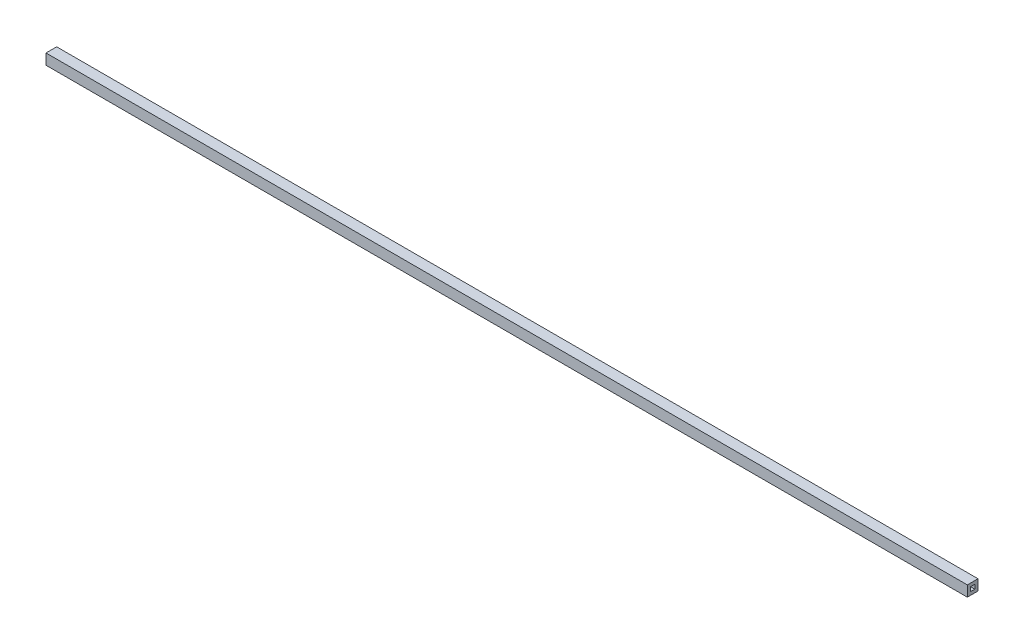
ISO-10303-21;
HEADER;
FILE_DESCRIPTION(('STEP AP214'),'2;1');
FILE_NAME('part.step','',(''),(''),'','','');
FILE_SCHEMA(('AUTOMOTIVE_DESIGN { 1 0 10303 214 1 1 1 1 }'));
ENDSEC;
DATA;
#1=APPLICATION_CONTEXT('core data for automotive mechanical design processes');
#2=APPLICATION_PROTOCOL_DEFINITION('international standard','automotive_design',2000,#1);
#3=PRODUCT_CONTEXT('',#1,'mechanical');
#4=PRODUCT('Part','Part','',(#3));
#5=PRODUCT_RELATED_PRODUCT_CATEGORY('part','',(#4));
#6=PRODUCT_DEFINITION_FORMATION('','',#4);
#7=PRODUCT_DEFINITION_CONTEXT('part definition',#1,'design');
#8=PRODUCT_DEFINITION('design','',#6,#7);
#9=PRODUCT_DEFINITION_SHAPE('','',#8);
#10=(LENGTH_UNIT() NAMED_UNIT(*) SI_UNIT(.MILLI.,.METRE.));
#11=(NAMED_UNIT(*) PLANE_ANGLE_UNIT() SI_UNIT($,.RADIAN.));
#12=(NAMED_UNIT(*) SI_UNIT($,.STERADIAN.) SOLID_ANGLE_UNIT());
#13=UNCERTAINTY_MEASURE_WITH_UNIT(LENGTH_MEASURE(1.E-05),#10,'distance_accuracy_value','');
#14=(GEOMETRIC_REPRESENTATION_CONTEXT(3) GLOBAL_UNCERTAINTY_ASSIGNED_CONTEXT((#13)) GLOBAL_UNIT_ASSIGNED_CONTEXT((#10,
#11,#12)) REPRESENTATION_CONTEXT('',''));
#15=CARTESIAN_POINT('',(0.,0.,0.));
#16=DIRECTION('',(0.,0.,1.));
#17=DIRECTION('',(1.,0.,0.));
#18=AXIS2_PLACEMENT_3D('',#15,#16,#17);
#19=CARTESIAN_POINT('',(432.,0.,0.));
#20=DIRECTION('',(1.,0.,0.));
#21=DIRECTION('',(0.,0.,-1.));
#22=AXIS2_PLACEMENT_3D('',#19,#20,#21);
#23=PLANE('',#22);
#24=DIRECTION('',(0.,1.,0.));
#25=VECTOR('',#24,1.);
#26=CARTESIAN_POINT('',(432.,2.5,-2.5));
#27=LINE('',#26,#25);
#28=CARTESIAN_POINT('',(432.,-2.5,-2.5));
#29=VERTEX_POINT('',#28);
#30=CARTESIAN_POINT('',(432.,2.5,-2.5));
#31=VERTEX_POINT('',#30);
#32=EDGE_CURVE('E159',#29,#31,#27,.T.);
#33=ORIENTED_EDGE('',*,*,#32,.T.);
#34=DIRECTION('',(0.,0.,1.));
#35=VECTOR('',#34,1.);
#36=CARTESIAN_POINT('',(432.,2.5,2.5));
#37=LINE('',#36,#35);
#38=CARTESIAN_POINT('',(432.,2.5,2.5));
#39=VERTEX_POINT('',#38);
#40=EDGE_CURVE('E163',#31,#39,#37,.T.);
#41=ORIENTED_EDGE('',*,*,#40,.T.);
#42=DIRECTION('',(0.,-1.,0.));
#43=VECTOR('',#42,1.);
#44=CARTESIAN_POINT('',(432.,2.5,2.5));
#45=LINE('',#44,#43);
#46=CARTESIAN_POINT('',(432.,-2.5,2.5));
#47=VERTEX_POINT('',#46);
#48=EDGE_CURVE('E167',#39,#47,#45,.T.);
#49=ORIENTED_EDGE('',*,*,#48,.T.);
#50=DIRECTION('',(0.,0.,-1.));
#51=VECTOR('',#50,1.);
#52=CARTESIAN_POINT('',(432.,-2.5,2.5));
#53=LINE('',#52,#51);
#54=EDGE_CURVE('E170',#47,#29,#53,.T.);
#55=ORIENTED_EDGE('',*,*,#54,.T.);
#56=EDGE_LOOP('',(#33,#41,#49,#55));
#57=FACE_BOUND('',#56,.T.);
#58=DIRECTION('',(0.,0.,1.));
#59=VECTOR('',#58,1.);
#60=CARTESIAN_POINT('',(432.,1.,1.));
#61=LINE('',#60,#59);
#62=CARTESIAN_POINT('',(432.,1.,-1.));
#63=VERTEX_POINT('',#62);
#64=CARTESIAN_POINT('',(432.,1.,1.));
#65=VERTEX_POINT('',#64);
#66=EDGE_CURVE('E120',#63,#65,#61,.T.);
#67=ORIENTED_EDGE('',*,*,#66,.F.);
#68=DIRECTION('',(0.,1.,0.));
#69=VECTOR('',#68,1.);
#70=CARTESIAN_POINT('',(432.,1.,-1.));
#71=LINE('',#70,#69);
#72=CARTESIAN_POINT('',(432.,-1.,-1.));
#73=VERTEX_POINT('',#72);
#74=EDGE_CURVE('E111',#73,#63,#71,.T.);
#75=ORIENTED_EDGE('',*,*,#74,.F.);
#76=DIRECTION('',(0.,0.,-1.));
#77=VECTOR('',#76,1.);
#78=CARTESIAN_POINT('',(432.,-1.,1.));
#79=LINE('',#78,#77);
#80=CARTESIAN_POINT('',(432.,-1.,1.));
#81=VERTEX_POINT('',#80);
#82=EDGE_CURVE('E137',#81,#73,#79,.T.);
#83=ORIENTED_EDGE('',*,*,#82,.F.);
#84=DIRECTION('',(0.,-1.,0.));
#85=VECTOR('',#84,1.);
#86=CARTESIAN_POINT('',(432.,1.,1.));
#87=LINE('',#86,#85);
#88=EDGE_CURVE('E133',#65,#81,#87,.T.);
#89=ORIENTED_EDGE('',*,*,#88,.F.);
#90=EDGE_LOOP('',(#67,#75,#83,#89));
#91=FACE_BOUND('',#90,.T.);
#92=ADVANCED_FACE('F45',(#57,#91),#23,.T.);
#93=CARTESIAN_POINT('',(0.,0.,0.));
#94=DIRECTION('',(1.,0.,0.));
#95=DIRECTION('',(0.,0.,-1.));
#96=AXIS2_PLACEMENT_3D('',#93,#94,#95);
#97=PLANE('',#96);
#98=DIRECTION('',(0.,1.,0.));
#99=VECTOR('',#98,1.);
#100=CARTESIAN_POINT('',(0.,2.5,-2.5));
#101=LINE('',#100,#99);
#102=CARTESIAN_POINT('',(0.,-2.5,-2.5));
#103=VERTEX_POINT('',#102);
#104=CARTESIAN_POINT('',(0.,2.5,-2.5));
#105=VERTEX_POINT('',#104);
#106=EDGE_CURVE('E129',#103,#105,#101,.T.);
#107=ORIENTED_EDGE('',*,*,#106,.F.);
#108=DIRECTION('',(0.,0.,-1.));
#109=VECTOR('',#108,1.);
#110=CARTESIAN_POINT('',(0.,-2.5,2.5));
#111=LINE('',#110,#109);
#112=CARTESIAN_POINT('',(0.,-2.5,2.5));
#113=VERTEX_POINT('',#112);
#114=EDGE_CURVE('E164',#113,#103,#111,.T.);
#115=ORIENTED_EDGE('',*,*,#114,.F.);
#116=DIRECTION('',(0.,-1.,0.));
#117=VECTOR('',#116,1.);
#118=CARTESIAN_POINT('',(0.,2.5,2.5));
#119=LINE('',#118,#117);
#120=CARTESIAN_POINT('',(0.,2.5,2.5));
#121=VERTEX_POINT('',#120);
#122=EDGE_CURVE('E180',#121,#113,#119,.T.);
#123=ORIENTED_EDGE('',*,*,#122,.F.);
#124=DIRECTION('',(0.,0.,1.));
#125=VECTOR('',#124,1.);
#126=CARTESIAN_POINT('',(0.,2.5,2.5));
#127=LINE('',#126,#125);
#128=EDGE_CURVE('E177',#105,#121,#127,.T.);
#129=ORIENTED_EDGE('',*,*,#128,.F.);
#130=EDGE_LOOP('',(#107,#115,#123,#129));
#131=FACE_BOUND('',#130,.T.);
#132=DIRECTION('',(0.,1.,0.));
#133=VECTOR('',#132,1.);
#134=CARTESIAN_POINT('',(0.,1.,-1.));
#135=LINE('',#134,#133);
#136=CARTESIAN_POINT('',(0.,-1.,-1.));
#137=VERTEX_POINT('',#136);
#138=CARTESIAN_POINT('',(0.,1.,-1.));
#139=VERTEX_POINT('',#138);
#140=EDGE_CURVE('E69',#137,#139,#135,.T.);
#141=ORIENTED_EDGE('',*,*,#140,.T.);
#142=DIRECTION('',(0.,0.,1.));
#143=VECTOR('',#142,1.);
#144=CARTESIAN_POINT('',(0.,1.,1.));
#145=LINE('',#144,#143);
#146=CARTESIAN_POINT('',(0.,1.,1.));
#147=VERTEX_POINT('',#146);
#148=EDGE_CURVE('E127',#139,#147,#145,.T.);
#149=ORIENTED_EDGE('',*,*,#148,.T.);
#150=DIRECTION('',(0.,-1.,0.));
#151=VECTOR('',#150,1.);
#152=CARTESIAN_POINT('',(0.,1.,1.));
#153=LINE('',#152,#151);
#154=CARTESIAN_POINT('',(0.,-1.,1.));
#155=VERTEX_POINT('',#154);
#156=EDGE_CURVE('E146',#147,#155,#153,.T.);
#157=ORIENTED_EDGE('',*,*,#156,.T.);
#158=DIRECTION('',(0.,0.,-1.));
#159=VECTOR('',#158,1.);
#160=CARTESIAN_POINT('',(0.,-1.,1.));
#161=LINE('',#160,#159);
#162=EDGE_CURVE('E121',#155,#137,#161,.T.);
#163=ORIENTED_EDGE('',*,*,#162,.T.);
#164=EDGE_LOOP('',(#141,#149,#157,#163));
#165=FACE_BOUND('',#164,.T.);
#166=ADVANCED_FACE('F203',(#131,#165),#97,.F.);
#167=CARTESIAN_POINT('',(432.,2.5,-2.5));
#168=DIRECTION('',(0.,0.,1.));
#169=DIRECTION('',(0.,-1.,0.));
#170=AXIS2_PLACEMENT_3D('',#167,#168,#169);
#171=PLANE('',#170);
#172=ORIENTED_EDGE('',*,*,#106,.T.);
#173=DIRECTION('',(-1.,0.,0.));
#174=VECTOR('',#173,1.);
#175=CARTESIAN_POINT('',(432.,2.5,-2.5));
#176=LINE('',#175,#174);
#177=EDGE_CURVE('E11',#31,#105,#176,.T.);
#178=ORIENTED_EDGE('',*,*,#177,.F.);
#179=ORIENTED_EDGE('',*,*,#32,.F.);
#180=DIRECTION('',(-1.,0.,0.));
#181=VECTOR('',#180,1.);
#182=CARTESIAN_POINT('',(432.,-2.5,-2.5));
#183=LINE('',#182,#181);
#184=EDGE_CURVE('E173',#29,#103,#183,.T.);
#185=ORIENTED_EDGE('',*,*,#184,.T.);
#186=EDGE_LOOP('',(#172,#178,#179,#185));
#187=FACE_BOUND('',#186,.T.);
#188=ADVANCED_FACE('F47',(#187),#171,.F.);
#189=CARTESIAN_POINT('',(432.,2.5,2.5));
#190=DIRECTION('',(0.,-1.,0.));
#191=DIRECTION('',(0.,0.,-1.));
#192=AXIS2_PLACEMENT_3D('',#189,#190,#191);
#193=PLANE('',#192);
#194=ORIENTED_EDGE('',*,*,#128,.T.);
#195=DIRECTION('',(-1.,0.,0.));
#196=VECTOR('',#195,1.);
#197=CARTESIAN_POINT('',(432.,2.5,2.5));
#198=LINE('',#197,#196);
#199=EDGE_CURVE('E54',#39,#121,#198,.T.);
#200=ORIENTED_EDGE('',*,*,#199,.F.);
#201=ORIENTED_EDGE('',*,*,#40,.F.);
#202=ORIENTED_EDGE('',*,*,#177,.T.);
#203=EDGE_LOOP('',(#194,#200,#201,#202));
#204=FACE_BOUND('',#203,.T.);
#205=ADVANCED_FACE('F213',(#204),#193,.F.);
#206=CARTESIAN_POINT('',(432.,2.5,2.5));
#207=DIRECTION('',(0.,0.,-1.));
#208=DIRECTION('',(0.,1.,0.));
#209=AXIS2_PLACEMENT_3D('',#206,#207,#208);
#210=PLANE('',#209);
#211=ORIENTED_EDGE('',*,*,#122,.T.);
#212=DIRECTION('',(-1.,0.,0.));
#213=VECTOR('',#212,1.);
#214=CARTESIAN_POINT('',(432.,-2.5,2.5));
#215=LINE('',#214,#213);
#216=EDGE_CURVE('E188',#47,#113,#215,.T.);
#217=ORIENTED_EDGE('',*,*,#216,.F.);
#218=ORIENTED_EDGE('',*,*,#48,.F.);
#219=ORIENTED_EDGE('',*,*,#199,.T.);
#220=EDGE_LOOP('',(#211,#217,#218,#219));
#221=FACE_BOUND('',#220,.T.);
#222=ADVANCED_FACE('F197',(#221),#210,.F.);
#223=CARTESIAN_POINT('',(432.,-2.5,2.5));
#224=DIRECTION('',(0.,1.,0.));
#225=DIRECTION('',(0.,0.,1.));
#226=AXIS2_PLACEMENT_3D('',#223,#224,#225);
#227=PLANE('',#226);
#228=ORIENTED_EDGE('',*,*,#114,.T.);
#229=ORIENTED_EDGE('',*,*,#184,.F.);
#230=ORIENTED_EDGE('',*,*,#54,.F.);
#231=ORIENTED_EDGE('',*,*,#216,.T.);
#232=EDGE_LOOP('',(#228,#229,#230,#231));
#233=FACE_BOUND('',#232,.T.);
#234=ADVANCED_FACE('F207',(#233),#227,.F.);
#235=CARTESIAN_POINT('',(432.,1.,-1.));
#236=DIRECTION('',(0.,0.,1.));
#237=DIRECTION('',(1.,0.,0.));
#238=AXIS2_PLACEMENT_3D('',#235,#236,#237);
#239=PLANE('',#238);
#240=ORIENTED_EDGE('',*,*,#140,.F.);
#241=DIRECTION('',(-1.,0.,0.));
#242=VECTOR('',#241,1.);
#243=CARTESIAN_POINT('',(432.,-1.,-1.));
#244=LINE('',#243,#242);
#245=EDGE_CURVE('E115',#73,#137,#244,.T.);
#246=ORIENTED_EDGE('',*,*,#245,.F.);
#247=ORIENTED_EDGE('',*,*,#74,.T.);
#248=DIRECTION('',(-1.,0.,0.));
#249=VECTOR('',#248,1.);
#250=CARTESIAN_POINT('',(432.,1.,-1.));
#251=LINE('',#250,#249);
#252=EDGE_CURVE('E114',#63,#139,#251,.T.);
#253=ORIENTED_EDGE('',*,*,#252,.T.);
#254=EDGE_LOOP('',(#240,#246,#247,#253));
#255=FACE_BOUND('',#254,.T.);
#256=ADVANCED_FACE('F113',(#255),#239,.T.);
#257=CARTESIAN_POINT('',(432.,1.,1.));
#258=DIRECTION('',(0.,-1.,0.));
#259=DIRECTION('',(0.,0.,-1.));
#260=AXIS2_PLACEMENT_3D('',#257,#258,#259);
#261=PLANE('',#260);
#262=ORIENTED_EDGE('',*,*,#148,.F.);
#263=ORIENTED_EDGE('',*,*,#252,.F.);
#264=ORIENTED_EDGE('',*,*,#66,.T.);
#265=DIRECTION('',(-1.,0.,0.));
#266=VECTOR('',#265,1.);
#267=CARTESIAN_POINT('',(432.,1.,1.));
#268=LINE('',#267,#266);
#269=EDGE_CURVE('E130',#65,#147,#268,.T.);
#270=ORIENTED_EDGE('',*,*,#269,.T.);
#271=EDGE_LOOP('',(#262,#263,#264,#270));
#272=FACE_BOUND('',#271,.T.);
#273=ADVANCED_FACE('F124',(#272),#261,.T.);
#274=CARTESIAN_POINT('',(432.,1.,1.));
#275=DIRECTION('',(0.,0.,-1.));
#276=DIRECTION('',(-1.,0.,0.));
#277=AXIS2_PLACEMENT_3D('',#274,#275,#276);
#278=PLANE('',#277);
#279=ORIENTED_EDGE('',*,*,#156,.F.);
#280=ORIENTED_EDGE('',*,*,#269,.F.);
#281=ORIENTED_EDGE('',*,*,#88,.T.);
#282=DIRECTION('',(-1.,0.,0.));
#283=VECTOR('',#282,1.);
#284=CARTESIAN_POINT('',(432.,-1.,1.));
#285=LINE('',#284,#283);
#286=EDGE_CURVE('E61',#81,#155,#285,.T.);
#287=ORIENTED_EDGE('',*,*,#286,.T.);
#288=EDGE_LOOP('',(#279,#280,#281,#287));
#289=FACE_BOUND('',#288,.T.);
#290=ADVANCED_FACE('F236',(#289),#278,.T.);
#291=CARTESIAN_POINT('',(432.,-1.,1.));
#292=DIRECTION('',(0.,1.,0.));
#293=DIRECTION('',(0.,0.,1.));
#294=AXIS2_PLACEMENT_3D('',#291,#292,#293);
#295=PLANE('',#294);
#296=ORIENTED_EDGE('',*,*,#162,.F.);
#297=ORIENTED_EDGE('',*,*,#286,.F.);
#298=ORIENTED_EDGE('',*,*,#82,.T.);
#299=ORIENTED_EDGE('',*,*,#245,.T.);
#300=EDGE_LOOP('',(#296,#297,#298,#299));
#301=FACE_BOUND('',#300,.T.);
#302=ADVANCED_FACE('F240',(#301),#295,.T.);
#303=CLOSED_SHELL('',(#92,#166,#188,#205,#222,#234,#256,#273,#290,#302));
#304=MANIFOLD_SOLID_BREP('B2',#303);
#305=ADVANCED_BREP_SHAPE_REPRESENTATION('',(#18,#304),#14);
#306=SHAPE_DEFINITION_REPRESENTATION(#9,#305);
ENDSEC;
END-ISO-10303-21;
